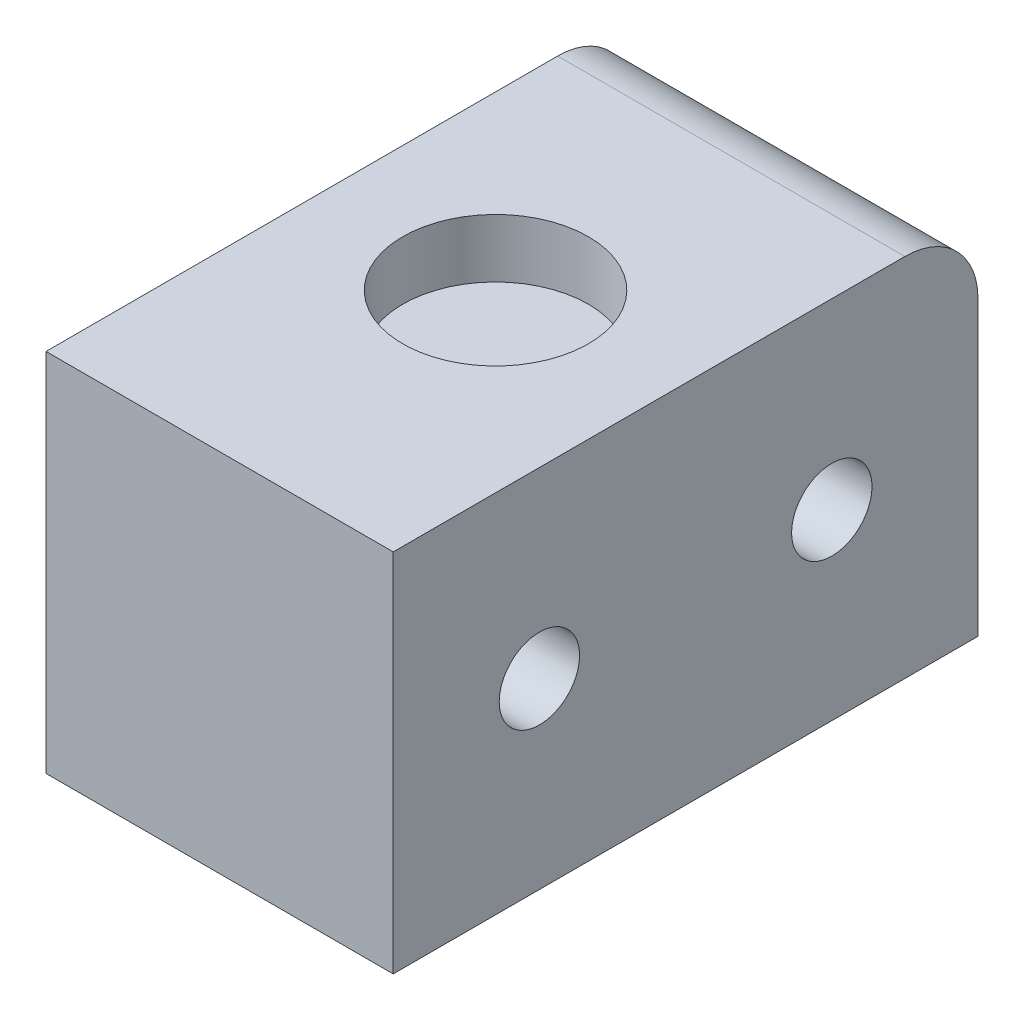
ISO-10303-21;
HEADER;
FILE_DESCRIPTION(('STEP AP214'),'2;1');
FILE_NAME('part.step','',(''),(''),'','','');
FILE_SCHEMA(('AUTOMOTIVE_DESIGN { 1 0 10303 214 1 1 1 1 }'));
ENDSEC;
DATA;
#1=APPLICATION_CONTEXT('core data for automotive mechanical design processes');
#2=APPLICATION_PROTOCOL_DEFINITION('international standard','automotive_design',2000,#1);
#3=PRODUCT_CONTEXT('',#1,'mechanical');
#4=PRODUCT('Part','Part','',(#3));
#5=PRODUCT_RELATED_PRODUCT_CATEGORY('part','',(#4));
#6=PRODUCT_DEFINITION_FORMATION('','',#4);
#7=PRODUCT_DEFINITION_CONTEXT('part definition',#1,'design');
#8=PRODUCT_DEFINITION('design','',#6,#7);
#9=PRODUCT_DEFINITION_SHAPE('','',#8);
#10=(LENGTH_UNIT() NAMED_UNIT(*) SI_UNIT(.MILLI.,.METRE.));
#11=(NAMED_UNIT(*) PLANE_ANGLE_UNIT() SI_UNIT($,.RADIAN.));
#12=(NAMED_UNIT(*) SI_UNIT($,.STERADIAN.) SOLID_ANGLE_UNIT());
#13=UNCERTAINTY_MEASURE_WITH_UNIT(LENGTH_MEASURE(1.E-05),#10,'distance_accuracy_value','');
#14=(GEOMETRIC_REPRESENTATION_CONTEXT(3) GLOBAL_UNCERTAINTY_ASSIGNED_CONTEXT((#13)) GLOBAL_UNIT_ASSIGNED_CONTEXT((#10,
#11,#12)) REPRESENTATION_CONTEXT('',''));
#15=CARTESIAN_POINT('',(0.,0.,0.));
#16=DIRECTION('',(0.,0.,1.));
#17=DIRECTION('',(1.,0.,0.));
#18=AXIS2_PLACEMENT_3D('',#15,#16,#17);
#19=CARTESIAN_POINT('',(-23.75,100.,0.));
#20=DIRECTION('',(-1.,0.,0.));
#21=DIRECTION('',(0.,0.,-1.));
#22=AXIS2_PLACEMENT_3D('',#19,#20,#21);
#23=PLANE('',#22);
#24=CARTESIAN_POINT('',(-23.7499999999999,87.5,-30.));
#25=DIRECTION('',(-1.,0.,0.));
#26=DIRECTION('',(0.,0.,1.));
#27=AXIS2_PLACEMENT_3D('',#24,#25,#26);
#28=CIRCLE('',#27,2.74999999999999);
#29=CARTESIAN_POINT('',(-23.7499999999999,87.5,-27.25));
#30=VERTEX_POINT('',#29);
#31=EDGE_CURVE('E167',#30,#30,#28,.T.);
#32=ORIENTED_EDGE('',*,*,#31,.F.);
#33=EDGE_LOOP('',(#32));
#34=FACE_BOUND('',#33,.T.);
#35=DIRECTION('',(0.,-1.,0.));
#36=VECTOR('',#35,1.);
#37=CARTESIAN_POINT('',(-23.75,100.,-40.));
#38=LINE('',#37,#36);
#39=CARTESIAN_POINT('',(-23.75,95.,-40.));
#40=VERTEX_POINT('',#39);
#41=CARTESIAN_POINT('',(-23.75,75.,-40.));
#42=VERTEX_POINT('',#41);
#43=EDGE_CURVE('E118',#40,#42,#38,.T.);
#44=ORIENTED_EDGE('',*,*,#43,.T.);
#45=DIRECTION('',(0.,0.,-1.));
#46=VECTOR('',#45,1.);
#47=CARTESIAN_POINT('',(-23.75,75.,0.));
#48=LINE('',#47,#46);
#49=CARTESIAN_POINT('',(-23.75,75.,0.));
#50=VERTEX_POINT('',#49);
#51=EDGE_CURVE('E98',#50,#42,#48,.T.);
#52=ORIENTED_EDGE('',*,*,#51,.F.);
#53=DIRECTION('',(0.,-1.,0.));
#54=VECTOR('',#53,1.);
#55=CARTESIAN_POINT('',(-23.75,100.,0.));
#56=LINE('',#55,#54);
#57=CARTESIAN_POINT('',(-23.75,100.,0.));
#58=VERTEX_POINT('',#57);
#59=EDGE_CURVE('E84',#58,#50,#56,.T.);
#60=ORIENTED_EDGE('',*,*,#59,.F.);
#61=DIRECTION('',(0.,0.,-1.));
#62=VECTOR('',#61,1.);
#63=CARTESIAN_POINT('',(-23.75,100.,0.));
#64=LINE('',#63,#62);
#65=CARTESIAN_POINT('',(-23.75,100.,-35.));
#66=VERTEX_POINT('',#65);
#67=EDGE_CURVE('E80',#58,#66,#64,.T.);
#68=ORIENTED_EDGE('',*,*,#67,.T.);
#69=CARTESIAN_POINT('',(-23.75,95.,-35.));
#70=DIRECTION('',(1.,0.,0.));
#71=DIRECTION('',(0.,0.,-1.));
#72=AXIS2_PLACEMENT_3D('',#69,#70,#71);
#73=CIRCLE('',#72,5.);
#74=EDGE_CURVE('E105',#40,#66,#73,.T.);
#75=ORIENTED_EDGE('',*,*,#74,.F.);
#76=EDGE_LOOP('',(#44,#52,#60,#68,#75));
#77=FACE_BOUND('',#76,.T.);
#78=CARTESIAN_POINT('',(-23.7499999999999,87.5,-10.));
#79=DIRECTION('',(-1.,0.,0.));
#80=DIRECTION('',(0.,0.,1.));
#81=AXIS2_PLACEMENT_3D('',#78,#79,#80);
#82=CIRCLE('',#81,2.74999999999999);
#83=CARTESIAN_POINT('',(-23.7499999999999,87.5,-7.25000000000001));
#84=VERTEX_POINT('',#83);
#85=EDGE_CURVE('E157',#84,#84,#82,.T.);
#86=ORIENTED_EDGE('',*,*,#85,.F.);
#87=EDGE_LOOP('',(#86));
#88=FACE_BOUND('',#87,.T.);
#89=ADVANCED_FACE('F32',(#34,#77,#88),#23,.T.);
#90=CARTESIAN_POINT('',(0.,100.,0.));
#91=DIRECTION('',(1.,0.,0.));
#92=DIRECTION('',(0.,1.,0.));
#93=AXIS2_PLACEMENT_3D('',#90,#91,#92);
#94=PLANE('',#93);
#95=CARTESIAN_POINT('',(0.,87.5,-30.));
#96=DIRECTION('',(-1.,0.,0.));
#97=DIRECTION('',(0.,0.,1.));
#98=AXIS2_PLACEMENT_3D('',#95,#96,#97);
#99=CIRCLE('',#98,2.74999999999999);
#100=CARTESIAN_POINT('',(0.,87.5,-27.25));
#101=VERTEX_POINT('',#100);
#102=EDGE_CURVE('E170',#101,#101,#99,.T.);
#103=ORIENTED_EDGE('',*,*,#102,.T.);
#104=EDGE_LOOP('',(#103));
#105=FACE_BOUND('',#104,.T.);
#106=CARTESIAN_POINT('',(0.,87.5,-10.));
#107=DIRECTION('',(-1.,0.,0.));
#108=DIRECTION('',(0.,0.,1.));
#109=AXIS2_PLACEMENT_3D('',#106,#107,#108);
#110=CIRCLE('',#109,2.74999999999999);
#111=CARTESIAN_POINT('',(0.,87.5,-7.25000000000001));
#112=VERTEX_POINT('',#111);
#113=EDGE_CURVE('E162',#112,#112,#110,.T.);
#114=ORIENTED_EDGE('',*,*,#113,.T.);
#115=EDGE_LOOP('',(#114));
#116=FACE_BOUND('',#115,.T.);
#117=DIRECTION('',(0.,0.,-1.));
#118=VECTOR('',#117,1.);
#119=CARTESIAN_POINT('',(0.,100.,0.));
#120=LINE('',#119,#118);
#121=CARTESIAN_POINT('',(0.,100.,0.));
#122=VERTEX_POINT('',#121);
#123=CARTESIAN_POINT('',(0.,100.,-35.));
#124=VERTEX_POINT('',#123);
#125=EDGE_CURVE('E78',#122,#124,#120,.T.);
#126=ORIENTED_EDGE('',*,*,#125,.F.);
#127=DIRECTION('',(0.,1.,0.));
#128=VECTOR('',#127,1.);
#129=CARTESIAN_POINT('',(0.,100.,0.));
#130=LINE('',#129,#128);
#131=CARTESIAN_POINT('',(0.,75.,0.));
#132=VERTEX_POINT('',#131);
#133=EDGE_CURVE('E85',#132,#122,#130,.T.);
#134=ORIENTED_EDGE('',*,*,#133,.F.);
#135=DIRECTION('',(0.,0.,-1.));
#136=VECTOR('',#135,1.);
#137=CARTESIAN_POINT('',(0.,75.,0.));
#138=LINE('',#137,#136);
#139=CARTESIAN_POINT('',(0.,75.,-40.));
#140=VERTEX_POINT('',#139);
#141=EDGE_CURVE('E106',#132,#140,#138,.T.);
#142=ORIENTED_EDGE('',*,*,#141,.T.);
#143=DIRECTION('',(0.,1.,0.));
#144=VECTOR('',#143,1.);
#145=CARTESIAN_POINT('',(0.,100.,-40.));
#146=LINE('',#145,#144);
#147=CARTESIAN_POINT('',(0.,95.,-40.));
#148=VERTEX_POINT('',#147);
#149=EDGE_CURVE('E116',#140,#148,#146,.T.);
#150=ORIENTED_EDGE('',*,*,#149,.T.);
#151=CARTESIAN_POINT('',(0.,95.,-35.));
#152=DIRECTION('',(-1.,0.,0.));
#153=DIRECTION('',(0.,1.,0.));
#154=AXIS2_PLACEMENT_3D('',#151,#152,#153);
#155=CIRCLE('',#154,5.);
#156=EDGE_CURVE('E11',#124,#148,#155,.T.);
#157=ORIENTED_EDGE('',*,*,#156,.F.);
#158=EDGE_LOOP('',(#126,#134,#142,#150,#157));
#159=FACE_BOUND('',#158,.T.);
#160=ADVANCED_FACE('F95',(#105,#116,#159),#94,.T.);
#161=CARTESIAN_POINT('',(0.,75.,0.));
#162=DIRECTION('',(0.,-1.,0.));
#163=DIRECTION('',(0.,0.,1.));
#164=AXIS2_PLACEMENT_3D('',#161,#162,#163);
#165=PLANE('',#164);
#166=DIRECTION('',(1.,0.,0.));
#167=VECTOR('',#166,1.);
#168=CARTESIAN_POINT('',(0.,75.,-40.));
#169=LINE('',#168,#167);
#170=EDGE_CURVE('E93',#42,#140,#169,.T.);
#171=ORIENTED_EDGE('',*,*,#170,.T.);
#172=ORIENTED_EDGE('',*,*,#141,.F.);
#173=DIRECTION('',(1.,0.,0.));
#174=VECTOR('',#173,1.);
#175=CARTESIAN_POINT('',(0.,75.,0.));
#176=LINE('',#175,#174);
#177=EDGE_CURVE('E89',#50,#132,#176,.T.);
#178=ORIENTED_EDGE('',*,*,#177,.F.);
#179=ORIENTED_EDGE('',*,*,#51,.T.);
#180=EDGE_LOOP('',(#171,#172,#178,#179));
#181=FACE_BOUND('',#180,.T.);
#182=ADVANCED_FACE('F123',(#181),#165,.T.);
#183=CARTESIAN_POINT('',(0.,100.,0.));
#184=DIRECTION('',(0.,1.,0.));
#185=DIRECTION('',(0.,0.,-1.));
#186=AXIS2_PLACEMENT_3D('',#183,#184,#185);
#187=PLANE('',#186);
#188=CARTESIAN_POINT('',(-12.,100.,-19.));
#189=DIRECTION('',(0.,-1.,0.));
#190=DIRECTION('',(0.,0.,-1.));
#191=AXIS2_PLACEMENT_3D('',#188,#189,#190);
#192=CIRCLE('',#191,6.35);
#193=CARTESIAN_POINT('',(-12.,100.,-25.35));
#194=VERTEX_POINT('',#193);
#195=EDGE_CURVE('E155',#194,#194,#192,.T.);
#196=ORIENTED_EDGE('',*,*,#195,.T.);
#197=EDGE_LOOP('',(#196));
#198=FACE_BOUND('',#197,.T.);
#199=ORIENTED_EDGE('',*,*,#67,.F.);
#200=DIRECTION('',(-1.,0.,0.));
#201=VECTOR('',#200,1.);
#202=CARTESIAN_POINT('',(0.,100.,0.));
#203=LINE('',#202,#201);
#204=EDGE_CURVE('E74',#122,#58,#203,.T.);
#205=ORIENTED_EDGE('',*,*,#204,.F.);
#206=ORIENTED_EDGE('',*,*,#125,.T.);
#207=DIRECTION('',(-1.,0.,0.));
#208=VECTOR('',#207,1.);
#209=CARTESIAN_POINT('',(0.,100.,-35.));
#210=LINE('',#209,#208);
#211=EDGE_CURVE('E40',#66,#124,#210,.F.);
#212=ORIENTED_EDGE('',*,*,#211,.F.);
#213=EDGE_LOOP('',(#199,#205,#206,#212));
#214=FACE_BOUND('',#213,.T.);
#215=ADVANCED_FACE('F76',(#198,#214),#187,.T.);
#216=CARTESIAN_POINT('',(0.,0.,0.));
#217=DIRECTION('',(0.,0.,1.));
#218=DIRECTION('',(-1.,0.,0.));
#219=AXIS2_PLACEMENT_3D('',#216,#217,#218);
#220=PLANE('',#219);
#221=ORIENTED_EDGE('',*,*,#133,.T.);
#222=ORIENTED_EDGE('',*,*,#204,.T.);
#223=ORIENTED_EDGE('',*,*,#59,.T.);
#224=ORIENTED_EDGE('',*,*,#177,.T.);
#225=EDGE_LOOP('',(#221,#222,#223,#224));
#226=FACE_BOUND('',#225,.T.);
#227=ADVANCED_FACE('F88',(#226),#220,.T.);
#228=CARTESIAN_POINT('',(0.,0.,-40.));
#229=DIRECTION('',(0.,0.,1.));
#230=DIRECTION('',(-1.,0.,0.));
#231=AXIS2_PLACEMENT_3D('',#228,#229,#230);
#232=PLANE('',#231);
#233=ORIENTED_EDGE('',*,*,#149,.F.);
#234=ORIENTED_EDGE('',*,*,#170,.F.);
#235=ORIENTED_EDGE('',*,*,#43,.F.);
#236=DIRECTION('',(-1.,0.,0.));
#237=VECTOR('',#236,1.);
#238=CARTESIAN_POINT('',(-23.75,95.,-40.));
#239=LINE('',#238,#237);
#240=EDGE_CURVE('E103',#148,#40,#239,.T.);
#241=ORIENTED_EDGE('',*,*,#240,.F.);
#242=EDGE_LOOP('',(#233,#234,#235,#241));
#243=FACE_BOUND('',#242,.T.);
#244=ADVANCED_FACE('F126',(#243),#232,.F.);
#245=CARTESIAN_POINT('',(-12.,96.,-19.));
#246=DIRECTION('',(0.,1.,0.));
#247=DIRECTION('',(0.,0.,-1.));
#248=AXIS2_PLACEMENT_3D('',#245,#246,#247);
#249=CYLINDRICAL_SURFACE('',#248,6.35);
#250=CARTESIAN_POINT('',(-12.,96.,-19.));
#251=DIRECTION('',(0.,-1.,0.));
#252=DIRECTION('',(0.,0.,-1.));
#253=AXIS2_PLACEMENT_3D('',#250,#251,#252);
#254=CIRCLE('',#253,6.35);
#255=CARTESIAN_POINT('',(-12.,96.,-25.35));
#256=VERTEX_POINT('',#255);
#257=EDGE_CURVE('E119',#256,#256,#254,.T.);
#258=ORIENTED_EDGE('',*,*,#257,.T.);
#259=EDGE_LOOP('',(#258));
#260=FACE_BOUND('',#259,.T.);
#261=ORIENTED_EDGE('',*,*,#195,.F.);
#262=EDGE_LOOP('',(#261));
#263=FACE_BOUND('',#262,.T.);
#264=ADVANCED_FACE('F128',(#260,#263),#249,.F.);
#265=CARTESIAN_POINT('',(-12.,96.,-19.));
#266=DIRECTION('',(0.,1.,0.));
#267=DIRECTION('',(0.,0.,-1.));
#268=AXIS2_PLACEMENT_3D('',#265,#266,#267);
#269=PLANE('',#268);
#270=ORIENTED_EDGE('',*,*,#257,.F.);
#271=EDGE_LOOP('',(#270));
#272=FACE_BOUND('',#271,.T.);
#273=ADVANCED_FACE('F134',(#272),#269,.T.);
#274=CARTESIAN_POINT('',(0.,87.5,-10.));
#275=DIRECTION('',(1.,0.,0.));
#276=DIRECTION('',(0.,0.,1.));
#277=AXIS2_PLACEMENT_3D('',#274,#275,#276);
#278=CYLINDRICAL_SURFACE('',#277,2.74999999999999);
#279=ORIENTED_EDGE('',*,*,#85,.T.);
#280=EDGE_LOOP('',(#279));
#281=FACE_BOUND('',#280,.T.);
#282=ORIENTED_EDGE('',*,*,#113,.F.);
#283=EDGE_LOOP('',(#282));
#284=FACE_BOUND('',#283,.T.);
#285=ADVANCED_FACE('F177',(#281,#284),#278,.F.);
#286=CARTESIAN_POINT('',(0.,87.5,-30.));
#287=DIRECTION('',(1.,0.,0.));
#288=DIRECTION('',(0.,0.,1.));
#289=AXIS2_PLACEMENT_3D('',#286,#287,#288);
#290=CYLINDRICAL_SURFACE('',#289,2.74999999999999);
#291=ORIENTED_EDGE('',*,*,#31,.T.);
#292=EDGE_LOOP('',(#291));
#293=FACE_BOUND('',#292,.T.);
#294=ORIENTED_EDGE('',*,*,#102,.F.);
#295=EDGE_LOOP('',(#294));
#296=FACE_BOUND('',#295,.T.);
#297=ADVANCED_FACE('F175',(#293,#296),#290,.F.);
#298=CARTESIAN_POINT('',(0.,95.,-35.));
#299=DIRECTION('',(1.,0.,0.));
#300=DIRECTION('',(0.,0.,1.));
#301=AXIS2_PLACEMENT_3D('',#298,#299,#300);
#302=CYLINDRICAL_SURFACE('',#301,5.);
#303=ORIENTED_EDGE('',*,*,#156,.T.);
#304=ORIENTED_EDGE('',*,*,#240,.T.);
#305=ORIENTED_EDGE('',*,*,#74,.T.);
#306=ORIENTED_EDGE('',*,*,#211,.T.);
#307=EDGE_LOOP('',(#303,#304,#305,#306));
#308=FACE_BOUND('',#307,.T.);
#309=ADVANCED_FACE('F34',(#308),#302,.T.);
#310=CLOSED_SHELL('',(#89,#160,#182,#215,#227,#244,#264,#273,#285,#297,#309));
#311=MANIFOLD_SOLID_BREP('B2',#310);
#312=ADVANCED_BREP_SHAPE_REPRESENTATION('',(#18,#311),#14);
#313=SHAPE_DEFINITION_REPRESENTATION(#9,#312);
ENDSEC;
END-ISO-10303-21;
